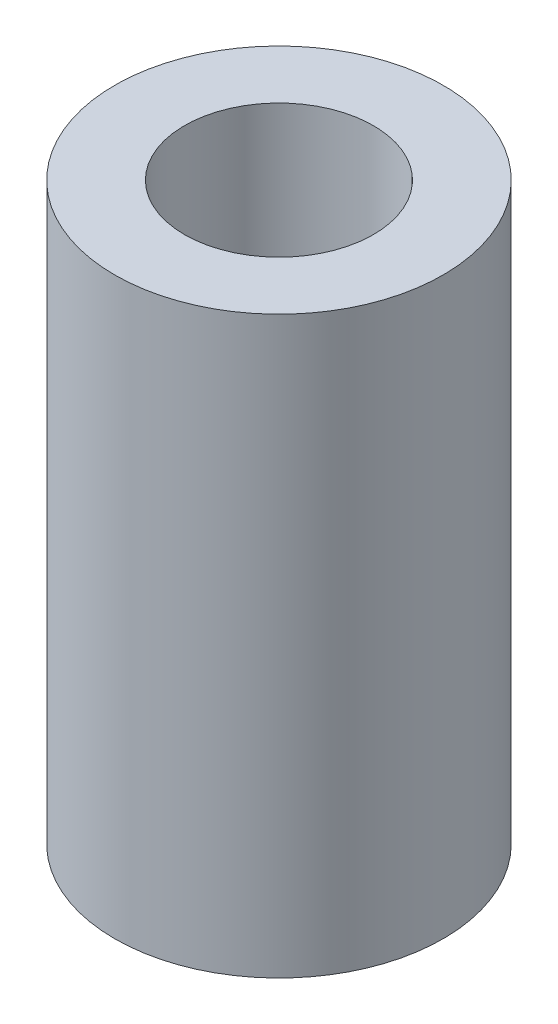
ISO-10303-21;
HEADER;
FILE_DESCRIPTION(('STEP AP214'),'2;1');
FILE_NAME('part.step','',(''),(''),'','','');
FILE_SCHEMA(('AUTOMOTIVE_DESIGN { 1 0 10303 214 1 1 1 1 }'));
ENDSEC;
DATA;
#1=APPLICATION_CONTEXT('core data for automotive mechanical design processes');
#2=APPLICATION_PROTOCOL_DEFINITION('international standard','automotive_design',2000,#1);
#3=PRODUCT_CONTEXT('',#1,'mechanical');
#4=PRODUCT('Part','Part','',(#3));
#5=PRODUCT_RELATED_PRODUCT_CATEGORY('part','',(#4));
#6=PRODUCT_DEFINITION_FORMATION('','',#4);
#7=PRODUCT_DEFINITION_CONTEXT('part definition',#1,'design');
#8=PRODUCT_DEFINITION('design','',#6,#7);
#9=PRODUCT_DEFINITION_SHAPE('','',#8);
#10=(LENGTH_UNIT() NAMED_UNIT(*) SI_UNIT(.MILLI.,.METRE.));
#11=(NAMED_UNIT(*) PLANE_ANGLE_UNIT() SI_UNIT($,.RADIAN.));
#12=(NAMED_UNIT(*) SI_UNIT($,.STERADIAN.) SOLID_ANGLE_UNIT());
#13=UNCERTAINTY_MEASURE_WITH_UNIT(LENGTH_MEASURE(1.E-05),#10,'distance_accuracy_value','');
#14=(GEOMETRIC_REPRESENTATION_CONTEXT(3) GLOBAL_UNCERTAINTY_ASSIGNED_CONTEXT((#13)) GLOBAL_UNIT_ASSIGNED_CONTEXT((#10,
#11,#12)) REPRESENTATION_CONTEXT('',''));
#15=CARTESIAN_POINT('',(0.,0.,0.));
#16=DIRECTION('',(0.,0.,1.));
#17=DIRECTION('',(1.,0.,0.));
#18=AXIS2_PLACEMENT_3D('',#15,#16,#17);
#19=CARTESIAN_POINT('',(0.,7.,0.));
#20=DIRECTION('',(0.,1.,0.));
#21=DIRECTION('',(0.,0.,1.));
#22=AXIS2_PLACEMENT_3D('',#19,#20,#21);
#23=PLANE('',#22);
#24=CARTESIAN_POINT('',(0.,7.,0.));
#25=DIRECTION('',(0.,1.,0.));
#26=DIRECTION('',(0.,0.,1.));
#27=AXIS2_PLACEMENT_3D('',#24,#25,#26);
#28=CIRCLE('',#27,2.);
#29=CARTESIAN_POINT('',(0.,7.,2.));
#30=VERTEX_POINT('',#29);
#31=EDGE_CURVE('E10',#30,#30,#28,.T.);
#32=ORIENTED_EDGE('',*,*,#31,.T.);
#33=EDGE_LOOP('',(#32));
#34=FACE_BOUND('',#33,.T.);
#35=CARTESIAN_POINT('',(0.,7.,0.));
#36=DIRECTION('',(0.,1.,0.));
#37=DIRECTION('',(0.,0.,1.));
#38=AXIS2_PLACEMENT_3D('',#35,#36,#37);
#39=CIRCLE('',#38,1.15);
#40=CARTESIAN_POINT('',(0.,7.,1.15));
#41=VERTEX_POINT('',#40);
#42=EDGE_CURVE('E55',#41,#41,#39,.T.);
#43=ORIENTED_EDGE('',*,*,#42,.F.);
#44=EDGE_LOOP('',(#43));
#45=FACE_BOUND('',#44,.T.);
#46=ADVANCED_FACE('F41',(#34,#45),#23,.T.);
#47=CARTESIAN_POINT('',(0.,0.,0.));
#48=DIRECTION('',(0.,1.,0.));
#49=DIRECTION('',(0.,0.,1.));
#50=AXIS2_PLACEMENT_3D('',#47,#48,#49);
#51=PLANE('',#50);
#52=CARTESIAN_POINT('',(0.,0.,0.));
#53=DIRECTION('',(0.,1.,0.));
#54=DIRECTION('',(0.,0.,1.));
#55=AXIS2_PLACEMENT_3D('',#52,#53,#54);
#56=CIRCLE('',#55,2.);
#57=CARTESIAN_POINT('',(0.,0.,2.));
#58=VERTEX_POINT('',#57);
#59=EDGE_CURVE('E44',#58,#58,#56,.T.);
#60=ORIENTED_EDGE('',*,*,#59,.F.);
#61=EDGE_LOOP('',(#60));
#62=FACE_BOUND('',#61,.T.);
#63=CARTESIAN_POINT('',(0.,0.,0.));
#64=DIRECTION('',(0.,1.,0.));
#65=DIRECTION('',(0.,0.,1.));
#66=AXIS2_PLACEMENT_3D('',#63,#64,#65);
#67=CIRCLE('',#66,1.15);
#68=CARTESIAN_POINT('',(0.,0.,1.15));
#69=VERTEX_POINT('',#68);
#70=EDGE_CURVE('E53',#69,#69,#67,.T.);
#71=ORIENTED_EDGE('',*,*,#70,.T.);
#72=EDGE_LOOP('',(#71));
#73=FACE_BOUND('',#72,.T.);
#74=ADVANCED_FACE('F62',(#62,#73),#51,.F.);
#75=CARTESIAN_POINT('',(0.,7.,0.));
#76=DIRECTION('',(0.,-1.,0.));
#77=DIRECTION('',(0.,0.,-1.));
#78=AXIS2_PLACEMENT_3D('',#75,#76,#77);
#79=CYLINDRICAL_SURFACE('',#78,2.);
#80=ORIENTED_EDGE('',*,*,#31,.F.);
#81=EDGE_LOOP('',(#80));
#82=FACE_BOUND('',#81,.T.);
#83=ORIENTED_EDGE('',*,*,#59,.T.);
#84=EDGE_LOOP('',(#83));
#85=FACE_BOUND('',#84,.T.);
#86=ADVANCED_FACE('F43',(#82,#85),#79,.T.);
#87=CARTESIAN_POINT('',(0.,7.,0.));
#88=DIRECTION('',(0.,-1.,0.));
#89=DIRECTION('',(0.,0.,-1.));
#90=AXIS2_PLACEMENT_3D('',#87,#88,#89);
#91=CYLINDRICAL_SURFACE('',#90,1.15);
#92=ORIENTED_EDGE('',*,*,#42,.T.);
#93=EDGE_LOOP('',(#92));
#94=FACE_BOUND('',#93,.T.);
#95=ORIENTED_EDGE('',*,*,#70,.F.);
#96=EDGE_LOOP('',(#95));
#97=FACE_BOUND('',#96,.T.);
#98=ADVANCED_FACE('F58',(#94,#97),#91,.F.);
#99=CLOSED_SHELL('',(#46,#74,#86,#98));
#100=MANIFOLD_SOLID_BREP('B2',#99);
#101=ADVANCED_BREP_SHAPE_REPRESENTATION('',(#18,#100),#14);
#102=SHAPE_DEFINITION_REPRESENTATION(#9,#101);
ENDSEC;
END-ISO-10303-21;
